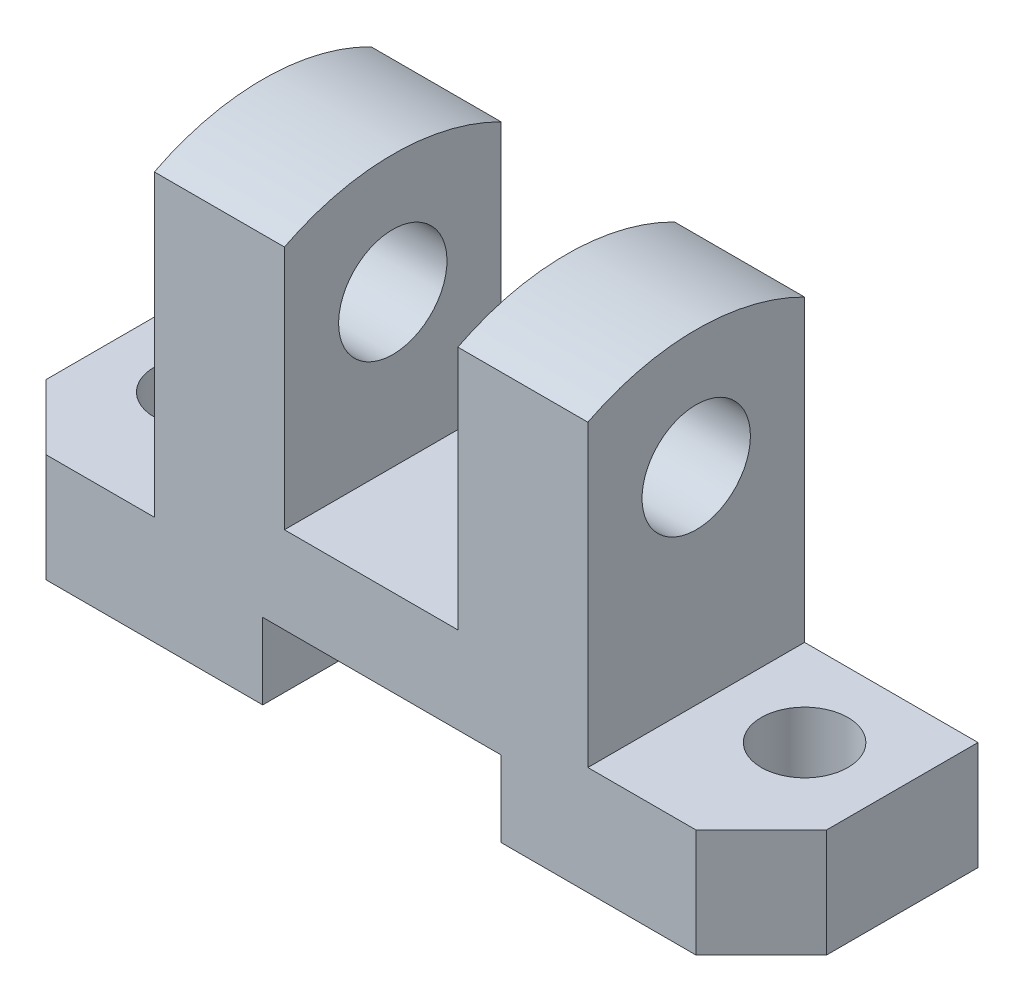
ISO-10303-21;
HEADER;
FILE_DESCRIPTION(('STEP AP214'),'2;1');
FILE_NAME('part.step','',(''),(''),'','','');
FILE_SCHEMA(('AUTOMOTIVE_DESIGN { 1 0 10303 214 1 1 1 1 }'));
ENDSEC;
DATA;
#1=APPLICATION_CONTEXT('core data for automotive mechanical design processes');
#2=APPLICATION_PROTOCOL_DEFINITION('international standard','automotive_design',2000,#1);
#3=PRODUCT_CONTEXT('',#1,'mechanical');
#4=PRODUCT('Part','Part','',(#3));
#5=PRODUCT_RELATED_PRODUCT_CATEGORY('part','',(#4));
#6=PRODUCT_DEFINITION_FORMATION('','',#4);
#7=PRODUCT_DEFINITION_CONTEXT('part definition',#1,'design');
#8=PRODUCT_DEFINITION('design','',#6,#7);
#9=PRODUCT_DEFINITION_SHAPE('','',#8);
#10=(LENGTH_UNIT() NAMED_UNIT(*) SI_UNIT(.MILLI.,.METRE.));
#11=(NAMED_UNIT(*) PLANE_ANGLE_UNIT() SI_UNIT($,.RADIAN.));
#12=(NAMED_UNIT(*) SI_UNIT($,.STERADIAN.) SOLID_ANGLE_UNIT());
#13=UNCERTAINTY_MEASURE_WITH_UNIT(LENGTH_MEASURE(1.E-05),#10,'distance_accuracy_value','');
#14=(GEOMETRIC_REPRESENTATION_CONTEXT(3) GLOBAL_UNCERTAINTY_ASSIGNED_CONTEXT((#13)) GLOBAL_UNIT_ASSIGNED_CONTEXT((#10,
#11,#12)) REPRESENTATION_CONTEXT('',''));
#15=CARTESIAN_POINT('',(0.,0.,0.));
#16=DIRECTION('',(0.,0.,1.));
#17=DIRECTION('',(1.,0.,0.));
#18=AXIS2_PLACEMENT_3D('',#15,#16,#17);
#19=CARTESIAN_POINT('',(57.15,28.575,0.));
#20=DIRECTION('',(-1.,0.,0.));
#21=DIRECTION('',(0.,0.,1.));
#22=AXIS2_PLACEMENT_3D('',#19,#20,#21);
#23=CYLINDRICAL_SURFACE('',#22,34.925);
#24=CARTESIAN_POINT('',(-31.75,28.575,0.));
#25=DIRECTION('',(1.,0.,0.));
#26=DIRECTION('',(0.,1.,0.));
#27=AXIS2_PLACEMENT_3D('',#24,#25,#26);
#28=CIRCLE('',#27,34.925);
#29=CARTESIAN_POINT('',(-31.75,59.6835197333464,-15.875));
#30=VERTEX_POINT('',#29);
#31=CARTESIAN_POINT('',(-31.75,59.6835197333464,15.875));
#32=VERTEX_POINT('',#31);
#33=EDGE_CURVE('E296',#30,#32,#28,.T.);
#34=ORIENTED_EDGE('',*,*,#33,.T.);
#35=DIRECTION('',(-1.,0.,0.));
#36=VECTOR('',#35,1.);
#37=CARTESIAN_POINT('',(57.15,59.6835197333464,15.875));
#38=LINE('',#37,#36);
#39=CARTESIAN_POINT('',(-12.7,59.6835197333464,15.875));
#40=VERTEX_POINT('',#39);
#41=EDGE_CURVE('E328',#40,#32,#38,.T.);
#42=ORIENTED_EDGE('',*,*,#41,.F.);
#43=CARTESIAN_POINT('',(-12.7,28.575,0.));
#44=DIRECTION('',(-1.,0.,0.));
#45=DIRECTION('',(0.,-1.,0.));
#46=AXIS2_PLACEMENT_3D('',#43,#44,#45);
#47=CIRCLE('',#46,34.925);
#48=CARTESIAN_POINT('',(-12.7,59.6835197333464,-15.875));
#49=VERTEX_POINT('',#48);
#50=EDGE_CURVE('E293',#40,#49,#47,.T.);
#51=ORIENTED_EDGE('',*,*,#50,.T.);
#52=DIRECTION('',(-1.,0.,0.));
#53=VECTOR('',#52,1.);
#54=CARTESIAN_POINT('',(57.15,59.6835197333464,-15.875));
#55=LINE('',#54,#53);
#56=EDGE_CURVE('E310',#49,#30,#55,.T.);
#57=ORIENTED_EDGE('',*,*,#56,.T.);
#58=EDGE_LOOP('',(#34,#42,#51,#57));
#59=FACE_BOUND('',#58,.T.);
#60=ADVANCED_FACE('F41',(#59),#23,.T.);
#61=CARTESIAN_POINT('',(57.15,0.,15.875));
#62=DIRECTION('',(0.,1.,0.));
#63=DIRECTION('',(0.,0.,1.));
#64=AXIS2_PLACEMENT_3D('',#61,#62,#63);
#65=PLANE('',#64);
#66=CARTESIAN_POINT('',(-44.45,0.,-3.175));
#67=DIRECTION('',(0.,1.,0.));
#68=DIRECTION('',(0.,0.,1.));
#69=AXIS2_PLACEMENT_3D('',#66,#67,#68);
#70=CIRCLE('',#69,6.34999999999999);
#71=CARTESIAN_POINT('',(-44.45,0.,3.17499999999999));
#72=VERTEX_POINT('',#71);
#73=EDGE_CURVE('E597',#72,#72,#70,.T.);
#74=ORIENTED_EDGE('',*,*,#73,.T.);
#75=EDGE_LOOP('',(#74));
#76=FACE_BOUND('',#75,.T.);
#77=DIRECTION('',(-1.,0.,0.));
#78=VECTOR('',#77,1.);
#79=CARTESIAN_POINT('',(57.15,0.,15.875));
#80=LINE('',#79,#78);
#81=CARTESIAN_POINT('',(-15.875,0.,15.875));
#82=VERTEX_POINT('',#81);
#83=CARTESIAN_POINT('',(-47.625,0.,15.875));
#84=VERTEX_POINT('',#83);
#85=EDGE_CURVE('E323',#82,#84,#80,.T.);
#86=ORIENTED_EDGE('',*,*,#85,.T.);
#87=DIRECTION('',(-0.707106781186546,0.,-0.707106781186549));
#88=VECTOR('',#87,1.);
#89=CARTESIAN_POINT('',(-47.625,0.,15.875));
#90=LINE('',#89,#88);
#91=CARTESIAN_POINT('',(-57.15,0.,6.34999999999991));
#92=VERTEX_POINT('',#91);
#93=EDGE_CURVE('E344',#84,#92,#90,.T.);
#94=ORIENTED_EDGE('',*,*,#93,.T.);
#95=DIRECTION('',(0.,0.,-1.));
#96=VECTOR('',#95,1.);
#97=CARTESIAN_POINT('',(-57.15,0.,15.875));
#98=LINE('',#97,#96);
#99=CARTESIAN_POINT('',(-57.15,0.,-15.875));
#100=VERTEX_POINT('',#99);
#101=EDGE_CURVE('E302',#92,#100,#98,.T.);
#102=ORIENTED_EDGE('',*,*,#101,.T.);
#103=DIRECTION('',(-1.,0.,0.));
#104=VECTOR('',#103,1.);
#105=CARTESIAN_POINT('',(57.15,0.,-15.875));
#106=LINE('',#105,#104);
#107=CARTESIAN_POINT('',(-15.875,0.,-15.875));
#108=VERTEX_POINT('',#107);
#109=EDGE_CURVE('E324',#108,#100,#106,.T.);
#110=ORIENTED_EDGE('',*,*,#109,.F.);
#111=DIRECTION('',(0.,0.,1.));
#112=VECTOR('',#111,1.);
#113=CARTESIAN_POINT('',(-15.875,0.,-15.875));
#114=LINE('',#113,#112);
#115=EDGE_CURVE('E268',#108,#82,#114,.T.);
#116=ORIENTED_EDGE('',*,*,#115,.T.);
#117=EDGE_LOOP('',(#86,#94,#102,#110,#116));
#118=FACE_BOUND('',#117,.T.);
#119=ADVANCED_FACE('F383',(#76,#118),#65,.F.);
#120=CARTESIAN_POINT('',(31.75,59.6835197333464,15.875));
#121=VERTEX_POINT('',#120);
#122=CARTESIAN_POINT('',(12.7,59.6835197333464,15.875));
#123=VERTEX_POINT('',#122);
#124=EDGE_CURVE('E332',#121,#123,#38,.T.);
#125=ORIENTED_EDGE('',*,*,#124,.F.);
#126=CARTESIAN_POINT('',(31.75,28.575,0.));
#127=DIRECTION('',(-1.,0.,0.));
#128=DIRECTION('',(0.,-1.,0.));
#129=AXIS2_PLACEMENT_3D('',#126,#127,#128);
#130=CIRCLE('',#129,34.925);
#131=CARTESIAN_POINT('',(31.75,59.6835197333464,-15.875));
#132=VERTEX_POINT('',#131);
#133=EDGE_CURVE('E299',#121,#132,#130,.T.);
#134=ORIENTED_EDGE('',*,*,#133,.T.);
#135=CARTESIAN_POINT('',(12.7,59.6835197333464,-15.875));
#136=VERTEX_POINT('',#135);
#137=EDGE_CURVE('E191',#132,#136,#55,.T.);
#138=ORIENTED_EDGE('',*,*,#137,.T.);
#139=CARTESIAN_POINT('',(12.7,28.575,0.));
#140=DIRECTION('',(1.,0.,0.));
#141=DIRECTION('',(0.,1.,0.));
#142=AXIS2_PLACEMENT_3D('',#139,#140,#141);
#143=CIRCLE('',#142,34.925);
#144=EDGE_CURVE('E205',#136,#123,#143,.T.);
#145=ORIENTED_EDGE('',*,*,#144,.T.);
#146=EDGE_LOOP('',(#125,#134,#138,#145));
#147=FACE_BOUND('',#146,.T.);
#148=ADVANCED_FACE('F390',(#147),#23,.T.);
#149=CARTESIAN_POINT('',(57.15,59.6835197333464,15.875));
#150=DIRECTION('',(0.,0.,-1.));
#151=DIRECTION('',(0.,1.,0.));
#152=AXIS2_PLACEMENT_3D('',#149,#150,#151);
#153=PLANE('',#152);
#154=DIRECTION('',(1.,0.,0.));
#155=VECTOR('',#154,1.);
#156=CARTESIAN_POINT('',(-57.15,15.875,15.875));
#157=LINE('',#156,#155);
#158=CARTESIAN_POINT('',(-47.625,15.875,15.875));
#159=VERTEX_POINT('',#158);
#160=CARTESIAN_POINT('',(-31.75,15.875,15.875));
#161=VERTEX_POINT('',#160);
#162=EDGE_CURVE('E217',#159,#161,#157,.T.);
#163=ORIENTED_EDGE('',*,*,#162,.F.);
#164=DIRECTION('',(0.,-1.,0.));
#165=VECTOR('',#164,1.);
#166=CARTESIAN_POINT('',(-47.625,0.,15.875));
#167=LINE('',#166,#165);
#168=EDGE_CURVE('E340',#159,#84,#167,.T.);
#169=ORIENTED_EDGE('',*,*,#168,.T.);
#170=ORIENTED_EDGE('',*,*,#85,.F.);
#171=DIRECTION('',(0.,-1.,0.));
#172=VECTOR('',#171,1.);
#173=CARTESIAN_POINT('',(-15.875,0.,15.875));
#174=LINE('',#173,#172);
#175=CARTESIAN_POINT('',(-15.875,11.1125,15.875));
#176=VERTEX_POINT('',#175);
#177=EDGE_CURVE('E269',#176,#82,#174,.T.);
#178=ORIENTED_EDGE('',*,*,#177,.F.);
#179=DIRECTION('',(-1.,0.,0.));
#180=VECTOR('',#179,1.);
#181=CARTESIAN_POINT('',(-15.875,11.1125,15.875));
#182=LINE('',#181,#180);
#183=CARTESIAN_POINT('',(19.05,11.1125,15.875));
#184=VERTEX_POINT('',#183);
#185=EDGE_CURVE('E260',#184,#176,#182,.T.);
#186=ORIENTED_EDGE('',*,*,#185,.F.);
#187=DIRECTION('',(0.,1.,0.));
#188=VECTOR('',#187,1.);
#189=CARTESIAN_POINT('',(19.05,0.,15.875));
#190=LINE('',#189,#188);
#191=CARTESIAN_POINT('',(19.05,0.,15.875));
#192=VERTEX_POINT('',#191);
#193=EDGE_CURVE('E272',#192,#184,#190,.T.);
#194=ORIENTED_EDGE('',*,*,#193,.F.);
#195=CARTESIAN_POINT('',(47.625,0.,15.875));
#196=VERTEX_POINT('',#195);
#197=EDGE_CURVE('E325',#196,#192,#80,.T.);
#198=ORIENTED_EDGE('',*,*,#197,.F.);
#199=DIRECTION('',(0.,1.,0.));
#200=VECTOR('',#199,1.);
#201=CARTESIAN_POINT('',(47.625,59.6835197333464,15.875));
#202=LINE('',#201,#200);
#203=CARTESIAN_POINT('',(47.625,15.875,15.875));
#204=VERTEX_POINT('',#203);
#205=EDGE_CURVE('E337',#196,#204,#202,.T.);
#206=ORIENTED_EDGE('',*,*,#205,.T.);
#207=DIRECTION('',(1.,0.,0.));
#208=VECTOR('',#207,1.);
#209=CARTESIAN_POINT('',(57.15,15.875,15.875));
#210=LINE('',#209,#208);
#211=CARTESIAN_POINT('',(31.75,15.875,15.875));
#212=VERTEX_POINT('',#211);
#213=EDGE_CURVE('E193',#212,#204,#210,.T.);
#214=ORIENTED_EDGE('',*,*,#213,.F.);
#215=DIRECTION('',(0.,-1.,0.));
#216=VECTOR('',#215,1.);
#217=CARTESIAN_POINT('',(31.75,63.5,15.875));
#218=LINE('',#217,#216);
#219=EDGE_CURVE('E175',#121,#212,#218,.T.);
#220=ORIENTED_EDGE('',*,*,#219,.F.);
#221=ORIENTED_EDGE('',*,*,#124,.T.);
#222=DIRECTION('',(0.,1.,0.));
#223=VECTOR('',#222,1.);
#224=CARTESIAN_POINT('',(12.7,63.5,15.875));
#225=LINE('',#224,#223);
#226=CARTESIAN_POINT('',(12.7,23.8125,15.875));
#227=VERTEX_POINT('',#226);
#228=EDGE_CURVE('E235',#227,#123,#225,.T.);
#229=ORIENTED_EDGE('',*,*,#228,.F.);
#230=DIRECTION('',(1.,0.,0.));
#231=VECTOR('',#230,1.);
#232=CARTESIAN_POINT('',(-12.7,23.8125,15.875));
#233=LINE('',#232,#231);
#234=CARTESIAN_POINT('',(-12.7,23.8125,15.875));
#235=VERTEX_POINT('',#234);
#236=EDGE_CURVE('E242',#235,#227,#233,.T.);
#237=ORIENTED_EDGE('',*,*,#236,.F.);
#238=DIRECTION('',(0.,-1.,0.));
#239=VECTOR('',#238,1.);
#240=CARTESIAN_POINT('',(-12.7,63.5,15.875));
#241=LINE('',#240,#239);
#242=EDGE_CURVE('E239',#40,#235,#241,.T.);
#243=ORIENTED_EDGE('',*,*,#242,.F.);
#244=ORIENTED_EDGE('',*,*,#41,.T.);
#245=DIRECTION('',(0.,1.,0.));
#246=VECTOR('',#245,1.);
#247=CARTESIAN_POINT('',(-31.75,63.5,15.875));
#248=LINE('',#247,#246);
#249=EDGE_CURVE('E212',#161,#32,#248,.T.);
#250=ORIENTED_EDGE('',*,*,#249,.F.);
#251=EDGE_LOOP('',(#163,#169,#170,#178,#186,#194,#198,#206,#214,#220,#221,#229,#237,#243,#244,#250));
#252=FACE_BOUND('',#251,.T.);
#253=ADVANCED_FACE('F366',(#252),#153,.F.);
#254=CARTESIAN_POINT('',(44.45,0.,-3.175));
#255=DIRECTION('',(0.,1.,0.));
#256=DIRECTION('',(0.,0.,1.));
#257=AXIS2_PLACEMENT_3D('',#254,#255,#256);
#258=CIRCLE('',#257,6.34999999999999);
#259=CARTESIAN_POINT('',(44.45,0.,3.17499999999999));
#260=VERTEX_POINT('',#259);
#261=EDGE_CURVE('E589',#260,#260,#258,.T.);
#262=ORIENTED_EDGE('',*,*,#261,.T.);
#263=EDGE_LOOP('',(#262));
#264=FACE_BOUND('',#263,.T.);
#265=DIRECTION('',(0.,0.,-1.));
#266=VECTOR('',#265,1.);
#267=CARTESIAN_POINT('',(57.15,0.,15.875));
#268=LINE('',#267,#266);
#269=CARTESIAN_POINT('',(57.15,0.,6.34999999999999));
#270=VERTEX_POINT('',#269);
#271=CARTESIAN_POINT('',(57.15,0.,-15.875));
#272=VERTEX_POINT('',#271);
#273=EDGE_CURVE('E303',#270,#272,#268,.T.);
#274=ORIENTED_EDGE('',*,*,#273,.F.);
#275=DIRECTION('',(0.707106781186549,0.,-0.707106781186546));
#276=VECTOR('',#275,1.);
#277=CARTESIAN_POINT('',(57.15,0.,6.34999999999999));
#278=LINE('',#277,#276);
#279=EDGE_CURVE('E52',#270,#196,#278,.F.);
#280=ORIENTED_EDGE('',*,*,#279,.T.);
#281=ORIENTED_EDGE('',*,*,#197,.T.);
#282=DIRECTION('',(0.,0.,1.));
#283=VECTOR('',#282,1.);
#284=CARTESIAN_POINT('',(19.05,0.,-15.875));
#285=LINE('',#284,#283);
#286=CARTESIAN_POINT('',(19.05,0.,-15.875));
#287=VERTEX_POINT('',#286);
#288=EDGE_CURVE('E284',#287,#192,#285,.T.);
#289=ORIENTED_EDGE('',*,*,#288,.F.);
#290=EDGE_CURVE('E319',#272,#287,#106,.T.);
#291=ORIENTED_EDGE('',*,*,#290,.F.);
#292=EDGE_LOOP('',(#274,#280,#281,#289,#291));
#293=FACE_BOUND('',#292,.T.);
#294=ADVANCED_FACE('F360',(#264,#293),#65,.F.);
#295=CARTESIAN_POINT('',(57.15,0.,-15.875));
#296=DIRECTION('',(0.,0.,1.));
#297=DIRECTION('',(0.,-1.,0.));
#298=AXIS2_PLACEMENT_3D('',#295,#296,#297);
#299=PLANE('',#298);
#300=DIRECTION('',(0.,-1.,0.));
#301=VECTOR('',#300,1.);
#302=CARTESIAN_POINT('',(31.75,63.5,-15.875));
#303=LINE('',#302,#301);
#304=CARTESIAN_POINT('',(31.75,15.875,-15.875));
#305=VERTEX_POINT('',#304);
#306=EDGE_CURVE('E172',#132,#305,#303,.T.);
#307=ORIENTED_EDGE('',*,*,#306,.T.);
#308=DIRECTION('',(1.,0.,0.));
#309=VECTOR('',#308,1.);
#310=CARTESIAN_POINT('',(57.15,15.875,-15.875));
#311=LINE('',#310,#309);
#312=CARTESIAN_POINT('',(57.15,15.875,-15.875));
#313=VERTEX_POINT('',#312);
#314=EDGE_CURVE('E179',#305,#313,#311,.T.);
#315=ORIENTED_EDGE('',*,*,#314,.T.);
#316=DIRECTION('',(0.,1.,0.));
#317=VECTOR('',#316,1.);
#318=CARTESIAN_POINT('',(57.15,0.,-15.875));
#319=LINE('',#318,#317);
#320=EDGE_CURVE('E306',#272,#313,#319,.T.);
#321=ORIENTED_EDGE('',*,*,#320,.F.);
#322=ORIENTED_EDGE('',*,*,#290,.T.);
#323=DIRECTION('',(0.,1.,0.));
#324=VECTOR('',#323,1.);
#325=CARTESIAN_POINT('',(19.05,0.,-15.875));
#326=LINE('',#325,#324);
#327=CARTESIAN_POINT('',(19.05,11.1125,-15.875));
#328=VERTEX_POINT('',#327);
#329=EDGE_CURVE('E259',#287,#328,#326,.T.);
#330=ORIENTED_EDGE('',*,*,#329,.T.);
#331=DIRECTION('',(-1.,0.,0.));
#332=VECTOR('',#331,1.);
#333=CARTESIAN_POINT('',(-15.875,11.1125,-15.875));
#334=LINE('',#333,#332);
#335=CARTESIAN_POINT('',(-15.875,11.1125,-15.875));
#336=VERTEX_POINT('',#335);
#337=EDGE_CURVE('E264',#328,#336,#334,.T.);
#338=ORIENTED_EDGE('',*,*,#337,.T.);
#339=DIRECTION('',(0.,-1.,0.));
#340=VECTOR('',#339,1.);
#341=CARTESIAN_POINT('',(-15.875,0.,-15.875));
#342=LINE('',#341,#340);
#343=EDGE_CURVE('E255',#336,#108,#342,.T.);
#344=ORIENTED_EDGE('',*,*,#343,.T.);
#345=ORIENTED_EDGE('',*,*,#109,.T.);
#346=DIRECTION('',(0.,1.,0.));
#347=VECTOR('',#346,1.);
#348=CARTESIAN_POINT('',(-57.15,0.,-15.875));
#349=LINE('',#348,#347);
#350=CARTESIAN_POINT('',(-57.15,15.875,-15.875));
#351=VERTEX_POINT('',#350);
#352=EDGE_CURVE('E307',#100,#351,#349,.T.);
#353=ORIENTED_EDGE('',*,*,#352,.T.);
#354=DIRECTION('',(1.,0.,0.));
#355=VECTOR('',#354,1.);
#356=CARTESIAN_POINT('',(-57.15,15.875,-15.875));
#357=LINE('',#356,#355);
#358=CARTESIAN_POINT('',(-31.75,15.875,-15.875));
#359=VERTEX_POINT('',#358);
#360=EDGE_CURVE('E207',#351,#359,#357,.T.);
#361=ORIENTED_EDGE('',*,*,#360,.T.);
#362=DIRECTION('',(0.,1.,0.));
#363=VECTOR('',#362,1.);
#364=CARTESIAN_POINT('',(-31.75,63.5,-15.875));
#365=LINE('',#364,#363);
#366=EDGE_CURVE('E211',#359,#30,#365,.T.);
#367=ORIENTED_EDGE('',*,*,#366,.T.);
#368=ORIENTED_EDGE('',*,*,#56,.F.);
#369=DIRECTION('',(0.,-1.,0.));
#370=VECTOR('',#369,1.);
#371=CARTESIAN_POINT('',(-12.7,0.,-15.875));
#372=LINE('',#371,#370);
#373=CARTESIAN_POINT('',(-12.7,23.8125,-15.875));
#374=VERTEX_POINT('',#373);
#375=EDGE_CURVE('E333',#49,#374,#372,.T.);
#376=ORIENTED_EDGE('',*,*,#375,.T.);
#377=DIRECTION('',(1.,0.,0.));
#378=VECTOR('',#377,1.);
#379=CARTESIAN_POINT('',(-12.7,23.8125,-15.875));
#380=LINE('',#379,#378);
#381=CARTESIAN_POINT('',(12.7,23.8125,-15.875));
#382=VERTEX_POINT('',#381);
#383=EDGE_CURVE('E230',#374,#382,#380,.T.);
#384=ORIENTED_EDGE('',*,*,#383,.T.);
#385=DIRECTION('',(0.,1.,0.));
#386=VECTOR('',#385,1.);
#387=CARTESIAN_POINT('',(12.7,63.5,-15.875));
#388=LINE('',#387,#386);
#389=EDGE_CURVE('E234',#382,#136,#388,.T.);
#390=ORIENTED_EDGE('',*,*,#389,.T.);
#391=ORIENTED_EDGE('',*,*,#137,.F.);
#392=EDGE_LOOP('',(#307,#315,#321,#322,#330,#338,#344,#345,#353,#361,#367,#368,#376,#384,#390,#391));
#393=FACE_BOUND('',#392,.T.);
#394=ADVANCED_FACE('F188',(#393),#299,.F.);
#395=CARTESIAN_POINT('',(57.15,28.575,0.));
#396=DIRECTION('',(-1.,0.,0.));
#397=DIRECTION('',(0.,0.,1.));
#398=AXIS2_PLACEMENT_3D('',#395,#396,#397);
#399=PLANE('',#398);
#400=DIRECTION('',(0.,0.,1.));
#401=VECTOR('',#400,1.);
#402=CARTESIAN_POINT('',(57.15,15.875,-15.875));
#403=LINE('',#402,#401);
#404=CARTESIAN_POINT('',(57.15,15.875,6.34999999999999));
#405=VERTEX_POINT('',#404);
#406=EDGE_CURVE('E178',#313,#405,#403,.T.);
#407=ORIENTED_EDGE('',*,*,#406,.T.);
#408=DIRECTION('',(0.,-1.,0.));
#409=VECTOR('',#408,1.);
#410=CARTESIAN_POINT('',(57.15,28.575,6.35));
#411=LINE('',#410,#409);
#412=EDGE_CURVE('E353',#405,#270,#411,.T.);
#413=ORIENTED_EDGE('',*,*,#412,.T.);
#414=ORIENTED_EDGE('',*,*,#273,.T.);
#415=ORIENTED_EDGE('',*,*,#320,.T.);
#416=EDGE_LOOP('',(#407,#413,#414,#415));
#417=FACE_BOUND('',#416,.T.);
#418=ADVANCED_FACE('F369',(#417),#399,.F.);
#419=CARTESIAN_POINT('',(-57.15,28.575,0.));
#420=DIRECTION('',(-1.,0.,0.));
#421=DIRECTION('',(0.,0.,1.));
#422=AXIS2_PLACEMENT_3D('',#419,#420,#421);
#423=PLANE('',#422);
#424=ORIENTED_EDGE('',*,*,#101,.F.);
#425=DIRECTION('',(0.,1.,0.));
#426=VECTOR('',#425,1.);
#427=CARTESIAN_POINT('',(-57.15,15.875,6.34999999999991));
#428=LINE('',#427,#426);
#429=CARTESIAN_POINT('',(-57.15,15.875,6.34999999999991));
#430=VERTEX_POINT('',#429);
#431=EDGE_CURVE('E347',#92,#430,#428,.T.);
#432=ORIENTED_EDGE('',*,*,#431,.T.);
#433=DIRECTION('',(0.,0.,1.));
#434=VECTOR('',#433,1.);
#435=CARTESIAN_POINT('',(-57.15,15.875,-15.875));
#436=LINE('',#435,#434);
#437=EDGE_CURVE('E216',#351,#430,#436,.T.);
#438=ORIENTED_EDGE('',*,*,#437,.F.);
#439=ORIENTED_EDGE('',*,*,#352,.F.);
#440=EDGE_LOOP('',(#424,#432,#438,#439));
#441=FACE_BOUND('',#440,.T.);
#442=ADVANCED_FACE('F404',(#441),#423,.T.);
#443=CARTESIAN_POINT('',(-31.75,63.5,-15.875));
#444=DIRECTION('',(1.,0.,0.));
#445=DIRECTION('',(0.,1.,0.));
#446=AXIS2_PLACEMENT_3D('',#443,#444,#445);
#447=PLANE('',#446);
#448=CARTESIAN_POINT('',(-31.75,46.0375,0.));
#449=DIRECTION('',(1.,0.,0.));
#450=DIRECTION('',(0.,1.,0.));
#451=AXIS2_PLACEMENT_3D('',#448,#449,#450);
#452=CIRCLE('',#451,7.93749999999999);
#453=CARTESIAN_POINT('',(-31.75,53.975,0.));
#454=VERTEX_POINT('',#453);
#455=EDGE_CURVE('E198',#454,#454,#452,.T.);
#456=ORIENTED_EDGE('',*,*,#455,.T.);
#457=EDGE_LOOP('',(#456));
#458=FACE_BOUND('',#457,.T.);
#459=ORIENTED_EDGE('',*,*,#33,.F.);
#460=ORIENTED_EDGE('',*,*,#366,.F.);
#461=DIRECTION('',(0.,0.,1.));
#462=VECTOR('',#461,1.);
#463=CARTESIAN_POINT('',(-31.75,15.875,-15.875));
#464=LINE('',#463,#462);
#465=EDGE_CURVE('E202',#359,#161,#464,.T.);
#466=ORIENTED_EDGE('',*,*,#465,.T.);
#467=ORIENTED_EDGE('',*,*,#249,.T.);
#468=EDGE_LOOP('',(#459,#460,#466,#467));
#469=FACE_BOUND('',#468,.T.);
#470=ADVANCED_FACE('F455',(#458,#469),#447,.F.);
#471=CARTESIAN_POINT('',(-57.15,15.875,-15.875));
#472=DIRECTION('',(0.,-1.,0.));
#473=DIRECTION('',(0.,0.,-1.));
#474=AXIS2_PLACEMENT_3D('',#471,#472,#473);
#475=PLANE('',#474);
#476=CARTESIAN_POINT('',(-44.45,15.875,-3.175));
#477=DIRECTION('',(0.,1.,0.));
#478=DIRECTION('',(0.,0.,1.));
#479=AXIS2_PLACEMENT_3D('',#476,#477,#478);
#480=CIRCLE('',#479,6.35);
#481=CARTESIAN_POINT('',(-44.45,15.875,3.175));
#482=VERTEX_POINT('',#481);
#483=EDGE_CURVE('E601',#482,#482,#480,.T.);
#484=ORIENTED_EDGE('',*,*,#483,.F.);
#485=EDGE_LOOP('',(#484));
#486=FACE_BOUND('',#485,.T.);
#487=ORIENTED_EDGE('',*,*,#437,.T.);
#488=DIRECTION('',(0.707106781186546,0.,0.707106781186549));
#489=VECTOR('',#488,1.);
#490=CARTESIAN_POINT('',(-47.625,15.875,15.875));
#491=LINE('',#490,#489);
#492=EDGE_CURVE('E350',#430,#159,#491,.T.);
#493=ORIENTED_EDGE('',*,*,#492,.T.);
#494=ORIENTED_EDGE('',*,*,#162,.T.);
#495=ORIENTED_EDGE('',*,*,#465,.F.);
#496=ORIENTED_EDGE('',*,*,#360,.F.);
#497=EDGE_LOOP('',(#487,#493,#494,#495,#496));
#498=FACE_BOUND('',#497,.T.);
#499=ADVANCED_FACE('F406',(#486,#498),#475,.F.);
#500=CARTESIAN_POINT('',(31.75,63.5,-15.875));
#501=DIRECTION('',(-1.,0.,0.));
#502=DIRECTION('',(0.,-1.,0.));
#503=AXIS2_PLACEMENT_3D('',#500,#501,#502);
#504=PLANE('',#503);
#505=CARTESIAN_POINT('',(31.75,46.0375,0.));
#506=DIRECTION('',(1.,0.,0.));
#507=DIRECTION('',(0.,0.,-1.));
#508=AXIS2_PLACEMENT_3D('',#505,#506,#507);
#509=CIRCLE('',#508,7.93749999999999);
#510=CARTESIAN_POINT('',(31.75,46.0375,-7.93749999999999));
#511=VERTEX_POINT('',#510);
#512=EDGE_CURVE('E584',#511,#511,#509,.T.);
#513=ORIENTED_EDGE('',*,*,#512,.F.);
#514=EDGE_LOOP('',(#513));
#515=FACE_BOUND('',#514,.T.);
#516=ORIENTED_EDGE('',*,*,#219,.T.);
#517=DIRECTION('',(0.,0.,1.));
#518=VECTOR('',#517,1.);
#519=CARTESIAN_POINT('',(31.75,15.875,-15.875));
#520=LINE('',#519,#518);
#521=EDGE_CURVE('E168',#305,#212,#520,.T.);
#522=ORIENTED_EDGE('',*,*,#521,.F.);
#523=ORIENTED_EDGE('',*,*,#306,.F.);
#524=ORIENTED_EDGE('',*,*,#133,.F.);
#525=EDGE_LOOP('',(#516,#522,#523,#524));
#526=FACE_BOUND('',#525,.T.);
#527=ADVANCED_FACE('F170',(#515,#526),#504,.F.);
#528=CARTESIAN_POINT('',(57.15,15.875,-15.875));
#529=DIRECTION('',(0.,-1.,0.));
#530=DIRECTION('',(0.,0.,-1.));
#531=AXIS2_PLACEMENT_3D('',#528,#529,#530);
#532=PLANE('',#531);
#533=CARTESIAN_POINT('',(44.45,15.875,-3.175));
#534=DIRECTION('',(0.,1.,0.));
#535=DIRECTION('',(0.,0.,1.));
#536=AXIS2_PLACEMENT_3D('',#533,#534,#535);
#537=CIRCLE('',#536,6.35);
#538=CARTESIAN_POINT('',(44.45,15.875,3.175));
#539=VERTEX_POINT('',#538);
#540=EDGE_CURVE('E593',#539,#539,#537,.T.);
#541=ORIENTED_EDGE('',*,*,#540,.F.);
#542=EDGE_LOOP('',(#541));
#543=FACE_BOUND('',#542,.T.);
#544=ORIENTED_EDGE('',*,*,#213,.T.);
#545=DIRECTION('',(-0.707106781186549,0.,0.707106781186546));
#546=VECTOR('',#545,1.);
#547=CARTESIAN_POINT('',(57.15,15.875,6.35));
#548=LINE('',#547,#546);
#549=EDGE_CURVE('E11',#204,#405,#548,.F.);
#550=ORIENTED_EDGE('',*,*,#549,.T.);
#551=ORIENTED_EDGE('',*,*,#406,.F.);
#552=ORIENTED_EDGE('',*,*,#314,.F.);
#553=ORIENTED_EDGE('',*,*,#521,.T.);
#554=EDGE_LOOP('',(#544,#550,#551,#552,#553));
#555=FACE_BOUND('',#554,.T.);
#556=ADVANCED_FACE('F182',(#543,#555),#532,.F.);
#557=CARTESIAN_POINT('',(-15.875,0.,-15.875));
#558=DIRECTION('',(-1.,0.,0.));
#559=DIRECTION('',(0.,0.,1.));
#560=AXIS2_PLACEMENT_3D('',#557,#558,#559);
#561=PLANE('',#560);
#562=ORIENTED_EDGE('',*,*,#177,.T.);
#563=ORIENTED_EDGE('',*,*,#115,.F.);
#564=ORIENTED_EDGE('',*,*,#343,.F.);
#565=DIRECTION('',(0.,0.,1.));
#566=VECTOR('',#565,1.);
#567=CARTESIAN_POINT('',(-15.875,11.1125,-15.875));
#568=LINE('',#567,#566);
#569=EDGE_CURVE('E243',#336,#176,#568,.T.);
#570=ORIENTED_EDGE('',*,*,#569,.T.);
#571=EDGE_LOOP('',(#562,#563,#564,#570));
#572=FACE_BOUND('',#571,.T.);
#573=ADVANCED_FACE('F458',(#572),#561,.F.);
#574=CARTESIAN_POINT('',(-15.875,11.1125,-15.875));
#575=DIRECTION('',(0.,1.,0.));
#576=DIRECTION('',(0.,0.,1.));
#577=AXIS2_PLACEMENT_3D('',#574,#575,#576);
#578=PLANE('',#577);
#579=ORIENTED_EDGE('',*,*,#185,.T.);
#580=ORIENTED_EDGE('',*,*,#569,.F.);
#581=ORIENTED_EDGE('',*,*,#337,.F.);
#582=DIRECTION('',(0.,0.,1.));
#583=VECTOR('',#582,1.);
#584=CARTESIAN_POINT('',(19.05,11.1125,-15.875));
#585=LINE('',#584,#583);
#586=EDGE_CURVE('E281',#328,#184,#585,.T.);
#587=ORIENTED_EDGE('',*,*,#586,.T.);
#588=EDGE_LOOP('',(#579,#580,#581,#587));
#589=FACE_BOUND('',#588,.T.);
#590=ADVANCED_FACE('F374',(#589),#578,.F.);
#591=CARTESIAN_POINT('',(19.05,0.,-15.875));
#592=DIRECTION('',(1.,0.,0.));
#593=DIRECTION('',(0.,0.,-1.));
#594=AXIS2_PLACEMENT_3D('',#591,#592,#593);
#595=PLANE('',#594);
#596=ORIENTED_EDGE('',*,*,#193,.T.);
#597=ORIENTED_EDGE('',*,*,#586,.F.);
#598=ORIENTED_EDGE('',*,*,#329,.F.);
#599=ORIENTED_EDGE('',*,*,#288,.T.);
#600=EDGE_LOOP('',(#596,#597,#598,#599));
#601=FACE_BOUND('',#600,.T.);
#602=ADVANCED_FACE('F371',(#601),#595,.F.);
#603=CARTESIAN_POINT('',(-12.7,63.5,-15.875));
#604=DIRECTION('',(-1.,0.,0.));
#605=DIRECTION('',(0.,-1.,0.));
#606=AXIS2_PLACEMENT_3D('',#603,#604,#605);
#607=PLANE('',#606);
#608=CARTESIAN_POINT('',(-12.7,46.0375,0.));
#609=DIRECTION('',(-1.,0.,0.));
#610=DIRECTION('',(0.,-1.,0.));
#611=AXIS2_PLACEMENT_3D('',#608,#609,#610);
#612=CIRCLE('',#611,7.93749999999999);
#613=CARTESIAN_POINT('',(-12.7,38.1,0.));
#614=VERTEX_POINT('',#613);
#615=EDGE_CURVE('E46',#614,#614,#612,.T.);
#616=ORIENTED_EDGE('',*,*,#615,.T.);
#617=EDGE_LOOP('',(#616));
#618=FACE_BOUND('',#617,.T.);
#619=ORIENTED_EDGE('',*,*,#242,.T.);
#620=DIRECTION('',(0.,0.,1.));
#621=VECTOR('',#620,1.);
#622=CARTESIAN_POINT('',(-12.7,23.8125,-15.875));
#623=LINE('',#622,#621);
#624=EDGE_CURVE('E238',#374,#235,#623,.T.);
#625=ORIENTED_EDGE('',*,*,#624,.F.);
#626=ORIENTED_EDGE('',*,*,#375,.F.);
#627=ORIENTED_EDGE('',*,*,#50,.F.);
#628=EDGE_LOOP('',(#619,#625,#626,#627));
#629=FACE_BOUND('',#628,.T.);
#630=ADVANCED_FACE('F415',(#618,#629),#607,.F.);
#631=CARTESIAN_POINT('',(12.7,63.5,-15.875));
#632=DIRECTION('',(1.,0.,0.));
#633=DIRECTION('',(0.,1.,0.));
#634=AXIS2_PLACEMENT_3D('',#631,#632,#633);
#635=PLANE('',#634);
#636=CARTESIAN_POINT('',(12.7,46.0375,0.));
#637=DIRECTION('',(1.,0.,0.));
#638=DIRECTION('',(0.,1.,0.));
#639=AXIS2_PLACEMENT_3D('',#636,#637,#638);
#640=CIRCLE('',#639,7.93749999999999);
#641=CARTESIAN_POINT('',(12.7,53.975,0.));
#642=VERTEX_POINT('',#641);
#643=EDGE_CURVE('E579',#642,#642,#640,.T.);
#644=ORIENTED_EDGE('',*,*,#643,.T.);
#645=EDGE_LOOP('',(#644));
#646=FACE_BOUND('',#645,.T.);
#647=ORIENTED_EDGE('',*,*,#144,.F.);
#648=ORIENTED_EDGE('',*,*,#389,.F.);
#649=DIRECTION('',(0.,0.,1.));
#650=VECTOR('',#649,1.);
#651=CARTESIAN_POINT('',(12.7,23.8125,-15.875));
#652=LINE('',#651,#650);
#653=EDGE_CURVE('E220',#382,#227,#652,.T.);
#654=ORIENTED_EDGE('',*,*,#653,.T.);
#655=ORIENTED_EDGE('',*,*,#228,.T.);
#656=EDGE_LOOP('',(#647,#648,#654,#655));
#657=FACE_BOUND('',#656,.T.);
#658=ADVANCED_FACE('F421',(#646,#657),#635,.F.);
#659=CARTESIAN_POINT('',(-12.7,23.8125,-15.875));
#660=DIRECTION('',(0.,-1.,0.));
#661=DIRECTION('',(1.,0.,0.));
#662=AXIS2_PLACEMENT_3D('',#659,#660,#661);
#663=PLANE('',#662);
#664=ORIENTED_EDGE('',*,*,#236,.T.);
#665=ORIENTED_EDGE('',*,*,#653,.F.);
#666=ORIENTED_EDGE('',*,*,#383,.F.);
#667=ORIENTED_EDGE('',*,*,#624,.T.);
#668=EDGE_LOOP('',(#664,#665,#666,#667));
#669=FACE_BOUND('',#668,.T.);
#670=ADVANCED_FACE('F419',(#669),#663,.F.);
#671=CARTESIAN_POINT('',(-47.625,59.6835197333464,15.875));
#672=DIRECTION('',(-0.707106781186549,0.,0.707106781186546));
#673=DIRECTION('',(0.,1.,0.));
#674=AXIS2_PLACEMENT_3D('',#671,#672,#673);
#675=PLANE('',#674);
#676=ORIENTED_EDGE('',*,*,#492,.F.);
#677=ORIENTED_EDGE('',*,*,#431,.F.);
#678=ORIENTED_EDGE('',*,*,#93,.F.);
#679=ORIENTED_EDGE('',*,*,#168,.F.);
#680=EDGE_LOOP('',(#676,#677,#678,#679));
#681=FACE_BOUND('',#680,.T.);
#682=ADVANCED_FACE('F400',(#681),#675,.T.);
#683=CARTESIAN_POINT('',(57.15,28.575,6.35));
#684=DIRECTION('',(-0.707106781186546,0.,-0.707106781186549));
#685=DIRECTION('',(0.,-1.,0.));
#686=AXIS2_PLACEMENT_3D('',#683,#684,#685);
#687=PLANE('',#686);
#688=ORIENTED_EDGE('',*,*,#549,.F.);
#689=ORIENTED_EDGE('',*,*,#205,.F.);
#690=ORIENTED_EDGE('',*,*,#279,.F.);
#691=ORIENTED_EDGE('',*,*,#412,.F.);
#692=EDGE_LOOP('',(#688,#689,#690,#691));
#693=FACE_BOUND('',#692,.T.);
#694=ADVANCED_FACE('F44',(#693),#687,.F.);
#695=CARTESIAN_POINT('',(31.75,46.0375,0.));
#696=DIRECTION('',(1.,0.,0.));
#697=DIRECTION('',(0.,0.,-1.));
#698=AXIS2_PLACEMENT_3D('',#695,#696,#697);
#699=CYLINDRICAL_SURFACE('',#698,7.93749999999999);
#700=ORIENTED_EDGE('',*,*,#615,.F.);
#701=EDGE_LOOP('',(#700));
#702=FACE_BOUND('',#701,.T.);
#703=ORIENTED_EDGE('',*,*,#455,.F.);
#704=EDGE_LOOP('',(#703));
#705=FACE_BOUND('',#704,.T.);
#706=ADVANCED_FACE('F493',(#702,#705),#699,.F.);
#707=ORIENTED_EDGE('',*,*,#512,.T.);
#708=EDGE_LOOP('',(#707));
#709=FACE_BOUND('',#708,.T.);
#710=ORIENTED_EDGE('',*,*,#643,.F.);
#711=EDGE_LOOP('',(#710));
#712=FACE_BOUND('',#711,.T.);
#713=ADVANCED_FACE('F498',(#709,#712),#699,.F.);
#714=CARTESIAN_POINT('',(44.45,15.875,-3.175));
#715=DIRECTION('',(0.,1.,0.));
#716=DIRECTION('',(0.,0.,1.));
#717=AXIS2_PLACEMENT_3D('',#714,#715,#716);
#718=CYLINDRICAL_SURFACE('',#717,6.35);
#719=ORIENTED_EDGE('',*,*,#261,.F.);
#720=EDGE_LOOP('',(#719));
#721=FACE_BOUND('',#720,.T.);
#722=ORIENTED_EDGE('',*,*,#540,.T.);
#723=EDGE_LOOP('',(#722));
#724=FACE_BOUND('',#723,.T.);
#725=ADVANCED_FACE('F510',(#721,#724),#718,.F.);
#726=CARTESIAN_POINT('',(-44.45,15.875,-3.175));
#727=DIRECTION('',(0.,1.,0.));
#728=DIRECTION('',(0.,0.,1.));
#729=AXIS2_PLACEMENT_3D('',#726,#727,#728);
#730=CYLINDRICAL_SURFACE('',#729,6.35);
#731=ORIENTED_EDGE('',*,*,#73,.F.);
#732=EDGE_LOOP('',(#731));
#733=FACE_BOUND('',#732,.T.);
#734=ORIENTED_EDGE('',*,*,#483,.T.);
#735=EDGE_LOOP('',(#734));
#736=FACE_BOUND('',#735,.T.);
#737=ADVANCED_FACE('F536',(#733,#736),#730,.F.);
#738=CLOSED_SHELL('',(#60,#119,#148,#253,#294,#394,#418,#442,#470,#499,#527,#556,#573,#590,#602,
#630,#658,#670,#682,#694,#706,#713,#725,#737));
#739=MANIFOLD_SOLID_BREP('B2',#738);
#740=ADVANCED_BREP_SHAPE_REPRESENTATION('',(#18,#739),#14);
#741=SHAPE_DEFINITION_REPRESENTATION(#9,#740);
ENDSEC;
END-ISO-10303-21;
